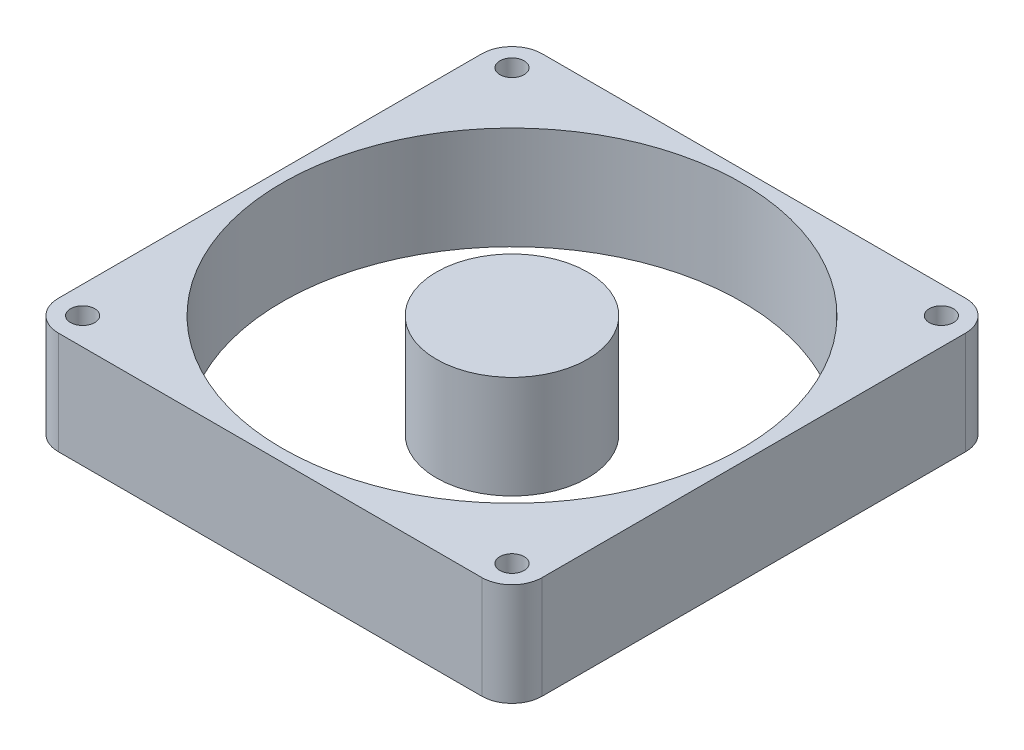
ISO-10303-21;
HEADER;
FILE_DESCRIPTION(('STEP AP214'),'2;1');
FILE_NAME('part.step','',(''),(''),'','','');
FILE_SCHEMA(('AUTOMOTIVE_DESIGN { 1 0 10303 214 1 1 1 1 }'));
ENDSEC;
DATA;
#1=APPLICATION_CONTEXT('core data for automotive mechanical design processes');
#2=APPLICATION_PROTOCOL_DEFINITION('international standard','automotive_design',2000,#1);
#3=PRODUCT_CONTEXT('',#1,'mechanical');
#4=PRODUCT('Part','Part','',(#3));
#5=PRODUCT_RELATED_PRODUCT_CATEGORY('part','',(#4));
#6=PRODUCT_DEFINITION_FORMATION('','',#4);
#7=PRODUCT_DEFINITION_CONTEXT('part definition',#1,'design');
#8=PRODUCT_DEFINITION('design','',#6,#7);
#9=PRODUCT_DEFINITION_SHAPE('','',#8);
#10=(LENGTH_UNIT() NAMED_UNIT(*) SI_UNIT(.MILLI.,.METRE.));
#11=(NAMED_UNIT(*) PLANE_ANGLE_UNIT() SI_UNIT($,.RADIAN.));
#12=(NAMED_UNIT(*) SI_UNIT($,.STERADIAN.) SOLID_ANGLE_UNIT());
#13=UNCERTAINTY_MEASURE_WITH_UNIT(LENGTH_MEASURE(1.E-05),#10,'distance_accuracy_value','');
#14=(GEOMETRIC_REPRESENTATION_CONTEXT(3) GLOBAL_UNCERTAINTY_ASSIGNED_CONTEXT((#13)) GLOBAL_UNIT_ASSIGNED_CONTEXT((#10,
#11,#12)) REPRESENTATION_CONTEXT('',''));
#15=CARTESIAN_POINT('',(0.,0.,0.));
#16=DIRECTION('',(0.,0.,1.));
#17=DIRECTION('',(1.,0.,0.));
#18=AXIS2_PLACEMENT_3D('',#15,#16,#17);
#19=CARTESIAN_POINT('',(35.,17.,-35.));
#20=DIRECTION('',(0.,-1.,0.));
#21=DIRECTION('',(0.,0.,-1.));
#22=AXIS2_PLACEMENT_3D('',#19,#20,#21);
#23=CYLINDRICAL_SURFACE('',#22,4.99999999999999);
#24=CARTESIAN_POINT('',(35.,0.,-35.));
#25=DIRECTION('',(0.,1.,0.));
#26=DIRECTION('',(0.,0.,1.));
#27=AXIS2_PLACEMENT_3D('',#24,#25,#26);
#28=CIRCLE('',#27,4.99999999999999);
#29=CARTESIAN_POINT('',(40.,0.,-35.));
#30=VERTEX_POINT('',#29);
#31=CARTESIAN_POINT('',(35.,0.,-40.));
#32=VERTEX_POINT('',#31);
#33=EDGE_CURVE('E47',#30,#32,#28,.T.);
#34=ORIENTED_EDGE('',*,*,#33,.T.);
#35=DIRECTION('',(0.,-1.,0.));
#36=VECTOR('',#35,1.);
#37=CARTESIAN_POINT('',(35.,17.,-40.));
#38=LINE('',#37,#36);
#39=CARTESIAN_POINT('',(35.,17.,-40.));
#40=VERTEX_POINT('',#39);
#41=EDGE_CURVE('E114',#40,#32,#38,.T.);
#42=ORIENTED_EDGE('',*,*,#41,.F.);
#43=CARTESIAN_POINT('',(35.,17.,-35.));
#44=DIRECTION('',(0.,1.,0.));
#45=DIRECTION('',(0.,0.,1.));
#46=AXIS2_PLACEMENT_3D('',#43,#44,#45);
#47=CIRCLE('',#46,4.99999999999999);
#48=CARTESIAN_POINT('',(40.,17.,-35.));
#49=VERTEX_POINT('',#48);
#50=EDGE_CURVE('E145',#49,#40,#47,.T.);
#51=ORIENTED_EDGE('',*,*,#50,.F.);
#52=DIRECTION('',(0.,-1.,0.));
#53=VECTOR('',#52,1.);
#54=CARTESIAN_POINT('',(40.,17.,-35.));
#55=LINE('',#54,#53);
#56=EDGE_CURVE('E116',#49,#30,#55,.T.);
#57=ORIENTED_EDGE('',*,*,#56,.T.);
#58=EDGE_LOOP('',(#34,#42,#51,#57));
#59=FACE_BOUND('',#58,.T.);
#60=ADVANCED_FACE('F43',(#59),#23,.T.);
#61=CARTESIAN_POINT('',(-35.,17.,-40.));
#62=DIRECTION('',(0.,0.,1.));
#63=DIRECTION('',(1.,0.,0.));
#64=AXIS2_PLACEMENT_3D('',#61,#62,#63);
#65=PLANE('',#64);
#66=DIRECTION('',(-1.,0.,0.));
#67=VECTOR('',#66,1.);
#68=CARTESIAN_POINT('',(-35.,0.,-40.));
#69=LINE('',#68,#67);
#70=CARTESIAN_POINT('',(-35.,0.,-40.));
#71=VERTEX_POINT('',#70);
#72=EDGE_CURVE('E60',#32,#71,#69,.T.);
#73=ORIENTED_EDGE('',*,*,#72,.T.);
#74=DIRECTION('',(0.,-1.,0.));
#75=VECTOR('',#74,1.);
#76=CARTESIAN_POINT('',(-35.,17.,-40.));
#77=LINE('',#76,#75);
#78=CARTESIAN_POINT('',(-35.,17.,-40.));
#79=VERTEX_POINT('',#78);
#80=EDGE_CURVE('E111',#79,#71,#77,.T.);
#81=ORIENTED_EDGE('',*,*,#80,.F.);
#82=DIRECTION('',(-1.,0.,0.));
#83=VECTOR('',#82,1.);
#84=CARTESIAN_POINT('',(-35.,17.,-40.));
#85=LINE('',#84,#83);
#86=EDGE_CURVE('E147',#40,#79,#85,.T.);
#87=ORIENTED_EDGE('',*,*,#86,.F.);
#88=ORIENTED_EDGE('',*,*,#41,.T.);
#89=EDGE_LOOP('',(#73,#81,#87,#88));
#90=FACE_BOUND('',#89,.T.);
#91=ADVANCED_FACE('F110',(#90),#65,.F.);
#92=CARTESIAN_POINT('',(-35.,17.,-35.));
#93=DIRECTION('',(0.,-1.,0.));
#94=DIRECTION('',(0.,0.,-1.));
#95=AXIS2_PLACEMENT_3D('',#92,#93,#94);
#96=CYLINDRICAL_SURFACE('',#95,4.99999999999999);
#97=CARTESIAN_POINT('',(-35.,0.,-35.));
#98=DIRECTION('',(0.,1.,0.));
#99=DIRECTION('',(0.,0.,-1.));
#100=AXIS2_PLACEMENT_3D('',#97,#98,#99);
#101=CIRCLE('',#100,4.99999999999999);
#102=CARTESIAN_POINT('',(-40.,0.,-35.));
#103=VERTEX_POINT('',#102);
#104=EDGE_CURVE('E120',#71,#103,#101,.T.);
#105=ORIENTED_EDGE('',*,*,#104,.T.);
#106=DIRECTION('',(0.,-1.,0.));
#107=VECTOR('',#106,1.);
#108=CARTESIAN_POINT('',(-40.,17.,-35.));
#109=LINE('',#108,#107);
#110=CARTESIAN_POINT('',(-40.,17.,-35.));
#111=VERTEX_POINT('',#110);
#112=EDGE_CURVE('E132',#111,#103,#109,.T.);
#113=ORIENTED_EDGE('',*,*,#112,.F.);
#114=CARTESIAN_POINT('',(-35.,17.,-35.));
#115=DIRECTION('',(0.,1.,0.));
#116=DIRECTION('',(0.,0.,-1.));
#117=AXIS2_PLACEMENT_3D('',#114,#115,#116);
#118=CIRCLE('',#117,4.99999999999999);
#119=EDGE_CURVE('E122',#79,#111,#118,.T.);
#120=ORIENTED_EDGE('',*,*,#119,.F.);
#121=ORIENTED_EDGE('',*,*,#80,.T.);
#122=EDGE_LOOP('',(#105,#113,#120,#121));
#123=FACE_BOUND('',#122,.T.);
#124=ADVANCED_FACE('F118',(#123),#96,.T.);
#125=CARTESIAN_POINT('',(-40.,17.,-35.));
#126=DIRECTION('',(1.,0.,0.));
#127=DIRECTION('',(0.,0.,-1.));
#128=AXIS2_PLACEMENT_3D('',#125,#126,#127);
#129=PLANE('',#128);
#130=DIRECTION('',(0.,0.,1.));
#131=VECTOR('',#130,1.);
#132=CARTESIAN_POINT('',(-40.,0.,-35.));
#133=LINE('',#132,#131);
#134=CARTESIAN_POINT('',(-40.,0.,35.));
#135=VERTEX_POINT('',#134);
#136=EDGE_CURVE('E123',#103,#135,#133,.T.);
#137=ORIENTED_EDGE('',*,*,#136,.T.);
#138=DIRECTION('',(0.,-1.,0.));
#139=VECTOR('',#138,1.);
#140=CARTESIAN_POINT('',(-40.,17.,35.));
#141=LINE('',#140,#139);
#142=CARTESIAN_POINT('',(-40.,17.,35.));
#143=VERTEX_POINT('',#142);
#144=EDGE_CURVE('E135',#143,#135,#141,.T.);
#145=ORIENTED_EDGE('',*,*,#144,.F.);
#146=DIRECTION('',(0.,0.,1.));
#147=VECTOR('',#146,1.);
#148=CARTESIAN_POINT('',(-40.,17.,-35.));
#149=LINE('',#148,#147);
#150=EDGE_CURVE('E150',#111,#143,#149,.T.);
#151=ORIENTED_EDGE('',*,*,#150,.F.);
#152=ORIENTED_EDGE('',*,*,#112,.T.);
#153=EDGE_LOOP('',(#137,#145,#151,#152));
#154=FACE_BOUND('',#153,.T.);
#155=ADVANCED_FACE('F232',(#154),#129,.F.);
#156=CARTESIAN_POINT('',(-35.,17.,35.));
#157=DIRECTION('',(0.,-1.,0.));
#158=DIRECTION('',(0.,0.,-1.));
#159=AXIS2_PLACEMENT_3D('',#156,#157,#158);
#160=CYLINDRICAL_SURFACE('',#159,4.99999999999999);
#161=CARTESIAN_POINT('',(-35.,0.,35.));
#162=DIRECTION('',(0.,1.,0.));
#163=DIRECTION('',(0.,0.,-1.));
#164=AXIS2_PLACEMENT_3D('',#161,#162,#163);
#165=CIRCLE('',#164,4.99999999999999);
#166=CARTESIAN_POINT('',(-35.,0.,40.));
#167=VERTEX_POINT('',#166);
#168=EDGE_CURVE('E133',#135,#167,#165,.T.);
#169=ORIENTED_EDGE('',*,*,#168,.T.);
#170=DIRECTION('',(0.,-1.,0.));
#171=VECTOR('',#170,1.);
#172=CARTESIAN_POINT('',(-35.,17.,40.));
#173=LINE('',#172,#171);
#174=CARTESIAN_POINT('',(-35.,17.,40.));
#175=VERTEX_POINT('',#174);
#176=EDGE_CURVE('E138',#175,#167,#173,.T.);
#177=ORIENTED_EDGE('',*,*,#176,.F.);
#178=CARTESIAN_POINT('',(-35.,17.,35.));
#179=DIRECTION('',(0.,1.,0.));
#180=DIRECTION('',(0.,0.,-1.));
#181=AXIS2_PLACEMENT_3D('',#178,#179,#180);
#182=CIRCLE('',#181,4.99999999999999);
#183=EDGE_CURVE('E152',#143,#175,#182,.T.);
#184=ORIENTED_EDGE('',*,*,#183,.F.);
#185=ORIENTED_EDGE('',*,*,#144,.T.);
#186=EDGE_LOOP('',(#169,#177,#184,#185));
#187=FACE_BOUND('',#186,.T.);
#188=ADVANCED_FACE('F227',(#187),#160,.T.);
#189=CARTESIAN_POINT('',(-35.,17.,40.));
#190=DIRECTION('',(0.,0.,-1.));
#191=DIRECTION('',(-1.,0.,0.));
#192=AXIS2_PLACEMENT_3D('',#189,#190,#191);
#193=PLANE('',#192);
#194=DIRECTION('',(1.,0.,0.));
#195=VECTOR('',#194,1.);
#196=CARTESIAN_POINT('',(-35.,0.,40.));
#197=LINE('',#196,#195);
#198=CARTESIAN_POINT('',(35.,0.,40.));
#199=VERTEX_POINT('',#198);
#200=EDGE_CURVE('E136',#167,#199,#197,.T.);
#201=ORIENTED_EDGE('',*,*,#200,.T.);
#202=DIRECTION('',(0.,-1.,0.));
#203=VECTOR('',#202,1.);
#204=CARTESIAN_POINT('',(35.,17.,40.));
#205=LINE('',#204,#203);
#206=CARTESIAN_POINT('',(35.,17.,40.));
#207=VERTEX_POINT('',#206);
#208=EDGE_CURVE('E141',#207,#199,#205,.T.);
#209=ORIENTED_EDGE('',*,*,#208,.F.);
#210=DIRECTION('',(1.,0.,0.));
#211=VECTOR('',#210,1.);
#212=CARTESIAN_POINT('',(-35.,17.,40.));
#213=LINE('',#212,#211);
#214=EDGE_CURVE('E154',#175,#207,#213,.T.);
#215=ORIENTED_EDGE('',*,*,#214,.F.);
#216=ORIENTED_EDGE('',*,*,#176,.T.);
#217=EDGE_LOOP('',(#201,#209,#215,#216));
#218=FACE_BOUND('',#217,.T.);
#219=ADVANCED_FACE('F224',(#218),#193,.F.);
#220=CARTESIAN_POINT('',(35.,17.,35.));
#221=DIRECTION('',(0.,-1.,0.));
#222=DIRECTION('',(0.,0.,-1.));
#223=AXIS2_PLACEMENT_3D('',#220,#221,#222);
#224=CYLINDRICAL_SURFACE('',#223,4.99999999999999);
#225=CARTESIAN_POINT('',(35.,0.,35.));
#226=DIRECTION('',(0.,1.,0.));
#227=DIRECTION('',(0.,0.,-1.));
#228=AXIS2_PLACEMENT_3D('',#225,#226,#227);
#229=CIRCLE('',#228,4.99999999999999);
#230=CARTESIAN_POINT('',(40.,0.,35.));
#231=VERTEX_POINT('',#230);
#232=EDGE_CURVE('E139',#199,#231,#229,.T.);
#233=ORIENTED_EDGE('',*,*,#232,.T.);
#234=DIRECTION('',(0.,-1.,0.));
#235=VECTOR('',#234,1.);
#236=CARTESIAN_POINT('',(40.,17.,35.));
#237=LINE('',#236,#235);
#238=CARTESIAN_POINT('',(40.,17.,35.));
#239=VERTEX_POINT('',#238);
#240=EDGE_CURVE('E144',#239,#231,#237,.T.);
#241=ORIENTED_EDGE('',*,*,#240,.F.);
#242=CARTESIAN_POINT('',(35.,17.,35.));
#243=DIRECTION('',(0.,1.,0.));
#244=DIRECTION('',(0.,0.,-1.));
#245=AXIS2_PLACEMENT_3D('',#242,#243,#244);
#246=CIRCLE('',#245,4.99999999999999);
#247=EDGE_CURVE('E52',#207,#239,#246,.T.);
#248=ORIENTED_EDGE('',*,*,#247,.F.);
#249=ORIENTED_EDGE('',*,*,#208,.T.);
#250=EDGE_LOOP('',(#233,#241,#248,#249));
#251=FACE_BOUND('',#250,.T.);
#252=ADVANCED_FACE('F220',(#251),#224,.T.);
#253=CARTESIAN_POINT('',(40.,17.,-35.));
#254=DIRECTION('',(-1.,0.,0.));
#255=DIRECTION('',(0.,0.,1.));
#256=AXIS2_PLACEMENT_3D('',#253,#254,#255);
#257=PLANE('',#256);
#258=DIRECTION('',(0.,0.,-1.));
#259=VECTOR('',#258,1.);
#260=CARTESIAN_POINT('',(40.,0.,-35.));
#261=LINE('',#260,#259);
#262=EDGE_CURVE('E142',#231,#30,#261,.T.);
#263=ORIENTED_EDGE('',*,*,#262,.T.);
#264=ORIENTED_EDGE('',*,*,#56,.F.);
#265=DIRECTION('',(0.,0.,-1.));
#266=VECTOR('',#265,1.);
#267=CARTESIAN_POINT('',(40.,17.,-35.));
#268=LINE('',#267,#266);
#269=EDGE_CURVE('E12',#239,#49,#268,.T.);
#270=ORIENTED_EDGE('',*,*,#269,.F.);
#271=ORIENTED_EDGE('',*,*,#240,.T.);
#272=EDGE_LOOP('',(#263,#264,#270,#271));
#273=FACE_BOUND('',#272,.T.);
#274=ADVANCED_FACE('F203',(#273),#257,.F.);
#275=CARTESIAN_POINT('',(35.,17.,-35.));
#276=DIRECTION('',(0.,1.,0.));
#277=DIRECTION('',(0.,0.,1.));
#278=AXIS2_PLACEMENT_3D('',#275,#276,#277);
#279=PLANE('',#278);
#280=CARTESIAN_POINT('',(-35.5,17.,-35.5));
#281=DIRECTION('',(0.,1.,0.));
#282=DIRECTION('',(0.,0.,-1.));
#283=AXIS2_PLACEMENT_3D('',#280,#281,#282);
#284=CIRCLE('',#283,2.);
#285=CARTESIAN_POINT('',(-35.5,17.,-37.5));
#286=VERTEX_POINT('',#285);
#287=EDGE_CURVE('E195',#286,#286,#284,.T.);
#288=ORIENTED_EDGE('',*,*,#287,.F.);
#289=EDGE_LOOP('',(#288));
#290=FACE_BOUND('',#289,.T.);
#291=CARTESIAN_POINT('',(-35.5,17.,35.5));
#292=DIRECTION('',(0.,1.,0.));
#293=DIRECTION('',(0.,0.,1.));
#294=AXIS2_PLACEMENT_3D('',#291,#292,#293);
#295=CIRCLE('',#294,2.);
#296=CARTESIAN_POINT('',(-35.5,17.,37.5));
#297=VERTEX_POINT('',#296);
#298=EDGE_CURVE('E189',#297,#297,#295,.T.);
#299=ORIENTED_EDGE('',*,*,#298,.F.);
#300=EDGE_LOOP('',(#299));
#301=FACE_BOUND('',#300,.T.);
#302=CARTESIAN_POINT('',(35.5,17.,35.5));
#303=DIRECTION('',(0.,1.,0.));
#304=DIRECTION('',(0.,0.,-1.));
#305=AXIS2_PLACEMENT_3D('',#302,#303,#304);
#306=CIRCLE('',#305,2.);
#307=CARTESIAN_POINT('',(35.5,17.,33.5));
#308=VERTEX_POINT('',#307);
#309=EDGE_CURVE('E183',#308,#308,#306,.T.);
#310=ORIENTED_EDGE('',*,*,#309,.F.);
#311=EDGE_LOOP('',(#310));
#312=FACE_BOUND('',#311,.T.);
#313=CARTESIAN_POINT('',(35.5,17.,-35.5));
#314=DIRECTION('',(0.,1.,0.));
#315=DIRECTION('',(0.,0.,1.));
#316=AXIS2_PLACEMENT_3D('',#313,#314,#315);
#317=CIRCLE('',#316,2.);
#318=CARTESIAN_POINT('',(35.5,17.,-33.5));
#319=VERTEX_POINT('',#318);
#320=EDGE_CURVE('E177',#319,#319,#317,.T.);
#321=ORIENTED_EDGE('',*,*,#320,.F.);
#322=EDGE_LOOP('',(#321));
#323=FACE_BOUND('',#322,.T.);
#324=CARTESIAN_POINT('',(0.,17.,0.));
#325=DIRECTION('',(0.,1.,0.));
#326=DIRECTION('',(0.,0.,1.));
#327=AXIS2_PLACEMENT_3D('',#324,#325,#326);
#328=CIRCLE('',#327,38.);
#329=CARTESIAN_POINT('',(0.,17.,38.));
#330=VERTEX_POINT('',#329);
#331=EDGE_CURVE('E171',#330,#330,#328,.T.);
#332=ORIENTED_EDGE('',*,*,#331,.F.);
#333=EDGE_LOOP('',(#332));
#334=FACE_BOUND('',#333,.T.);
#335=ORIENTED_EDGE('',*,*,#50,.T.);
#336=ORIENTED_EDGE('',*,*,#86,.T.);
#337=ORIENTED_EDGE('',*,*,#119,.T.);
#338=ORIENTED_EDGE('',*,*,#150,.T.);
#339=ORIENTED_EDGE('',*,*,#183,.T.);
#340=ORIENTED_EDGE('',*,*,#214,.T.);
#341=ORIENTED_EDGE('',*,*,#247,.T.);
#342=ORIENTED_EDGE('',*,*,#269,.T.);
#343=EDGE_LOOP('',(#335,#336,#337,#338,#339,#340,#341,#342));
#344=FACE_BOUND('',#343,.T.);
#345=ADVANCED_FACE('F45',(#290,#301,#312,#323,#334,#344),#279,.T.);
#346=CARTESIAN_POINT('',(35.,0.,-35.));
#347=DIRECTION('',(0.,1.,0.));
#348=DIRECTION('',(0.,0.,1.));
#349=AXIS2_PLACEMENT_3D('',#346,#347,#348);
#350=PLANE('',#349);
#351=CARTESIAN_POINT('',(-35.5,0.,-35.5));
#352=DIRECTION('',(0.,1.,0.));
#353=DIRECTION('',(0.,0.,1.));
#354=AXIS2_PLACEMENT_3D('',#351,#352,#353);
#355=CIRCLE('',#354,2.);
#356=CARTESIAN_POINT('',(-35.5,0.,-33.5));
#357=VERTEX_POINT('',#356);
#358=EDGE_CURVE('E192',#357,#357,#355,.F.);
#359=ORIENTED_EDGE('',*,*,#358,.F.);
#360=EDGE_LOOP('',(#359));
#361=FACE_BOUND('',#360,.T.);
#362=CARTESIAN_POINT('',(-35.5,0.,35.5));
#363=DIRECTION('',(0.,1.,0.));
#364=DIRECTION('',(0.,0.,1.));
#365=AXIS2_PLACEMENT_3D('',#362,#363,#364);
#366=CIRCLE('',#365,2.);
#367=CARTESIAN_POINT('',(-35.5,0.,37.5));
#368=VERTEX_POINT('',#367);
#369=EDGE_CURVE('E186',#368,#368,#366,.F.);
#370=ORIENTED_EDGE('',*,*,#369,.F.);
#371=EDGE_LOOP('',(#370));
#372=FACE_BOUND('',#371,.T.);
#373=CARTESIAN_POINT('',(35.5,0.,35.5));
#374=DIRECTION('',(0.,1.,0.));
#375=DIRECTION('',(0.,0.,1.));
#376=AXIS2_PLACEMENT_3D('',#373,#374,#375);
#377=CIRCLE('',#376,2.);
#378=CARTESIAN_POINT('',(35.5,0.,37.5));
#379=VERTEX_POINT('',#378);
#380=EDGE_CURVE('E180',#379,#379,#377,.F.);
#381=ORIENTED_EDGE('',*,*,#380,.F.);
#382=EDGE_LOOP('',(#381));
#383=FACE_BOUND('',#382,.T.);
#384=CARTESIAN_POINT('',(35.5,0.,-35.5));
#385=DIRECTION('',(0.,1.,0.));
#386=DIRECTION('',(0.,0.,1.));
#387=AXIS2_PLACEMENT_3D('',#384,#385,#386);
#388=CIRCLE('',#387,2.);
#389=CARTESIAN_POINT('',(35.5,0.,-33.5));
#390=VERTEX_POINT('',#389);
#391=EDGE_CURVE('E174',#390,#390,#388,.F.);
#392=ORIENTED_EDGE('',*,*,#391,.F.);
#393=EDGE_LOOP('',(#392));
#394=FACE_BOUND('',#393,.T.);
#395=CARTESIAN_POINT('',(0.,0.,0.));
#396=DIRECTION('',(0.,1.,0.));
#397=DIRECTION('',(0.,0.,1.));
#398=AXIS2_PLACEMENT_3D('',#395,#396,#397);
#399=CIRCLE('',#398,38.);
#400=CARTESIAN_POINT('',(0.,0.,38.));
#401=VERTEX_POINT('',#400);
#402=EDGE_CURVE('E168',#401,#401,#399,.F.);
#403=ORIENTED_EDGE('',*,*,#402,.F.);
#404=EDGE_LOOP('',(#403));
#405=FACE_BOUND('',#404,.T.);
#406=ORIENTED_EDGE('',*,*,#33,.F.);
#407=ORIENTED_EDGE('',*,*,#262,.F.);
#408=ORIENTED_EDGE('',*,*,#232,.F.);
#409=ORIENTED_EDGE('',*,*,#200,.F.);
#410=ORIENTED_EDGE('',*,*,#168,.F.);
#411=ORIENTED_EDGE('',*,*,#136,.F.);
#412=ORIENTED_EDGE('',*,*,#104,.F.);
#413=ORIENTED_EDGE('',*,*,#72,.F.);
#414=EDGE_LOOP('',(#406,#407,#408,#409,#410,#411,#412,#413));
#415=FACE_BOUND('',#414,.T.);
#416=ADVANCED_FACE('F126',(#361,#372,#383,#394,#405,#415),#350,.F.);
#417=CARTESIAN_POINT('',(0.,-113.137084989848,0.));
#418=DIRECTION('',(0.,1.,0.));
#419=DIRECTION('',(0.,0.,1.));
#420=AXIS2_PLACEMENT_3D('',#417,#418,#419);
#421=CYLINDRICAL_SURFACE('',#420,38.);
#422=ORIENTED_EDGE('',*,*,#331,.T.);
#423=EDGE_LOOP('',(#422));
#424=FACE_BOUND('',#423,.T.);
#425=ORIENTED_EDGE('',*,*,#402,.T.);
#426=EDGE_LOOP('',(#425));
#427=FACE_BOUND('',#426,.T.);
#428=ADVANCED_FACE('F248',(#424,#427),#421,.F.);
#429=CARTESIAN_POINT('',(35.5,-5.65685424949239,-35.5));
#430=DIRECTION('',(0.,1.,0.));
#431=DIRECTION('',(0.,0.,1.));
#432=AXIS2_PLACEMENT_3D('',#429,#430,#431);
#433=CYLINDRICAL_SURFACE('',#432,2.);
#434=ORIENTED_EDGE('',*,*,#391,.T.);
#435=EDGE_LOOP('',(#434));
#436=FACE_BOUND('',#435,.T.);
#437=ORIENTED_EDGE('',*,*,#320,.T.);
#438=EDGE_LOOP('',(#437));
#439=FACE_BOUND('',#438,.T.);
#440=ADVANCED_FACE('F251',(#436,#439),#433,.F.);
#441=CARTESIAN_POINT('',(35.5,-5.65685424949239,35.5));
#442=DIRECTION('',(0.,1.,0.));
#443=DIRECTION('',(0.,0.,1.));
#444=AXIS2_PLACEMENT_3D('',#441,#442,#443);
#445=CYLINDRICAL_SURFACE('',#444,2.);
#446=ORIENTED_EDGE('',*,*,#380,.T.);
#447=EDGE_LOOP('',(#446));
#448=FACE_BOUND('',#447,.T.);
#449=ORIENTED_EDGE('',*,*,#309,.T.);
#450=EDGE_LOOP('',(#449));
#451=FACE_BOUND('',#450,.T.);
#452=ADVANCED_FACE('F255',(#448,#451),#445,.F.);
#453=CARTESIAN_POINT('',(-35.5,-5.65685424949239,35.5));
#454=DIRECTION('',(0.,1.,0.));
#455=DIRECTION('',(0.,0.,1.));
#456=AXIS2_PLACEMENT_3D('',#453,#454,#455);
#457=CYLINDRICAL_SURFACE('',#456,2.);
#458=ORIENTED_EDGE('',*,*,#369,.T.);
#459=EDGE_LOOP('',(#458));
#460=FACE_BOUND('',#459,.T.);
#461=ORIENTED_EDGE('',*,*,#298,.T.);
#462=EDGE_LOOP('',(#461));
#463=FACE_BOUND('',#462,.T.);
#464=ADVANCED_FACE('F259',(#460,#463),#457,.F.);
#465=CARTESIAN_POINT('',(-35.5,-5.65685424949239,-35.5));
#466=DIRECTION('',(0.,1.,0.));
#467=DIRECTION('',(0.,0.,1.));
#468=AXIS2_PLACEMENT_3D('',#465,#466,#467);
#469=CYLINDRICAL_SURFACE('',#468,2.);
#470=ORIENTED_EDGE('',*,*,#358,.T.);
#471=EDGE_LOOP('',(#470));
#472=FACE_BOUND('',#471,.T.);
#473=ORIENTED_EDGE('',*,*,#287,.T.);
#474=EDGE_LOOP('',(#473));
#475=FACE_BOUND('',#474,.T.);
#476=ADVANCED_FACE('F199',(#472,#475),#469,.F.);
#477=CLOSED_SHELL('',(#60,#91,#124,#155,#188,#219,#252,#274,#345,#416,#428,#440,#452,#464,#476));
#478=MANIFOLD_SOLID_BREP('B2',#477);
#479=CARTESIAN_POINT('',(35.,0.,-35.));
#480=DIRECTION('',(0.,1.,0.));
#481=DIRECTION('',(0.,0.,1.));
#482=AXIS2_PLACEMENT_3D('',#479,#480,#481);
#483=PLANE('',#482);
#484=CARTESIAN_POINT('',(0.,0.,0.));
#485=DIRECTION('',(0.,1.,0.));
#486=DIRECTION('',(0.,0.,1.));
#487=AXIS2_PLACEMENT_3D('',#484,#485,#486);
#488=CIRCLE('',#487,12.5);
#489=CARTESIAN_POINT('',(0.,0.,12.5));
#490=VERTEX_POINT('',#489);
#491=EDGE_CURVE('E42',#490,#490,#488,.T.);
#492=ORIENTED_EDGE('',*,*,#491,.F.);
#493=EDGE_LOOP('',(#492));
#494=FACE_BOUND('',#493,.T.);
#495=ADVANCED_FACE('F382',(#494),#483,.F.);
#496=CARTESIAN_POINT('',(0.,0.,0.));
#497=DIRECTION('',(0.,1.,0.));
#498=DIRECTION('',(0.,0.,1.));
#499=AXIS2_PLACEMENT_3D('',#496,#497,#498);
#500=CYLINDRICAL_SURFACE('',#499,12.5);
#501=ORIENTED_EDGE('',*,*,#491,.T.);
#502=EDGE_LOOP('',(#501));
#503=FACE_BOUND('',#502,.T.);
#504=CARTESIAN_POINT('',(0.,17.,0.));
#505=DIRECTION('',(0.,1.,0.));
#506=DIRECTION('',(0.,0.,1.));
#507=AXIS2_PLACEMENT_3D('',#504,#505,#506);
#508=CIRCLE('',#507,12.5);
#509=CARTESIAN_POINT('',(0.,17.,12.5));
#510=VERTEX_POINT('',#509);
#511=EDGE_CURVE('E389',#510,#510,#508,.T.);
#512=ORIENTED_EDGE('',*,*,#511,.F.);
#513=EDGE_LOOP('',(#512));
#514=FACE_BOUND('',#513,.T.);
#515=ADVANCED_FACE('F396',(#503,#514),#500,.T.);
#516=CARTESIAN_POINT('',(35.,17.,-35.));
#517=DIRECTION('',(0.,1.,0.));
#518=DIRECTION('',(0.,0.,1.));
#519=AXIS2_PLACEMENT_3D('',#516,#517,#518);
#520=PLANE('',#519);
#521=ORIENTED_EDGE('',*,*,#511,.T.);
#522=EDGE_LOOP('',(#521));
#523=FACE_BOUND('',#522,.T.);
#524=ADVANCED_FACE('F384',(#523),#520,.T.);
#525=CLOSED_SHELL('',(#495,#515,#524));
#526=MANIFOLD_SOLID_BREP('B6',#525);
#527=ADVANCED_BREP_SHAPE_REPRESENTATION('',(#18,#478,#526),#14);
#528=SHAPE_DEFINITION_REPRESENTATION(#9,#527);
ENDSEC;
END-ISO-10303-21;
